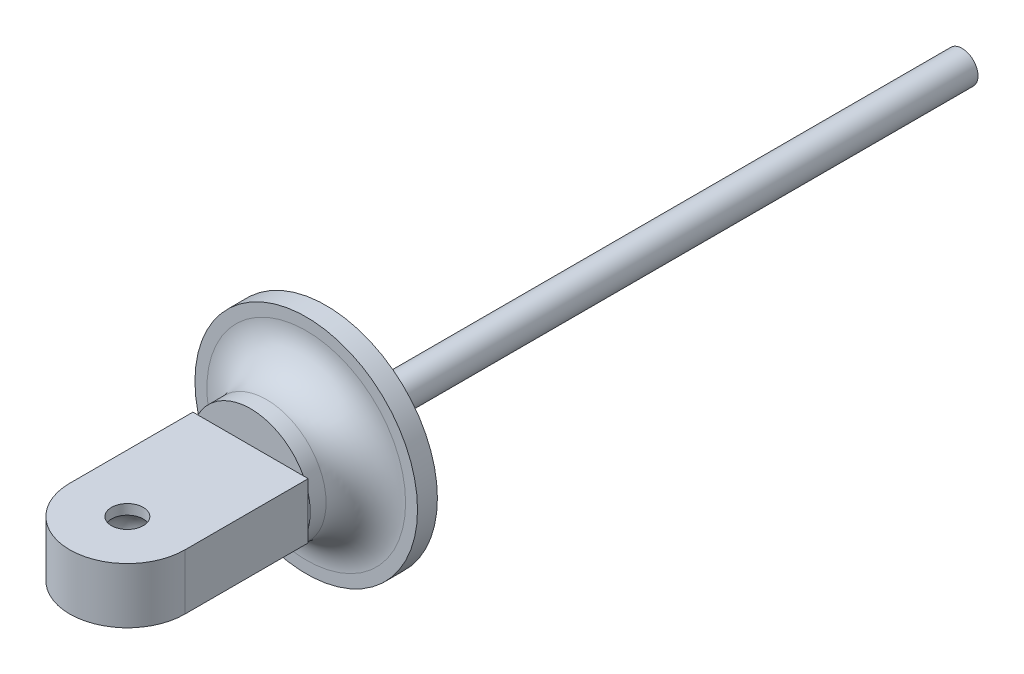
ISO-10303-21;
HEADER;
FILE_DESCRIPTION(('STEP AP214'),'2;1');
FILE_NAME('part.step','',(''),(''),'','','');
FILE_SCHEMA(('AUTOMOTIVE_DESIGN { 1 0 10303 214 1 1 1 1 }'));
ENDSEC;
DATA;
#1=APPLICATION_CONTEXT('core data for automotive mechanical design processes');
#2=APPLICATION_PROTOCOL_DEFINITION('international standard','automotive_design',2000,#1);
#3=PRODUCT_CONTEXT('',#1,'mechanical');
#4=PRODUCT('Part','Part','',(#3));
#5=PRODUCT_RELATED_PRODUCT_CATEGORY('part','',(#4));
#6=PRODUCT_DEFINITION_FORMATION('','',#4);
#7=PRODUCT_DEFINITION_CONTEXT('part definition',#1,'design');
#8=PRODUCT_DEFINITION('design','',#6,#7);
#9=PRODUCT_DEFINITION_SHAPE('','',#8);
#10=(LENGTH_UNIT() NAMED_UNIT(*) SI_UNIT(.MILLI.,.METRE.));
#11=(NAMED_UNIT(*) PLANE_ANGLE_UNIT() SI_UNIT($,.RADIAN.));
#12=(NAMED_UNIT(*) SI_UNIT($,.STERADIAN.) SOLID_ANGLE_UNIT());
#13=UNCERTAINTY_MEASURE_WITH_UNIT(LENGTH_MEASURE(1.E-05),#10,'distance_accuracy_value','');
#14=(GEOMETRIC_REPRESENTATION_CONTEXT(3) GLOBAL_UNCERTAINTY_ASSIGNED_CONTEXT((#13)) GLOBAL_UNIT_ASSIGNED_CONTEXT((#10,
#11,#12)) REPRESENTATION_CONTEXT('',''));
#15=CARTESIAN_POINT('',(0.,0.,0.));
#16=DIRECTION('',(0.,0.,1.));
#17=DIRECTION('',(1.,0.,0.));
#18=AXIS2_PLACEMENT_3D('',#15,#16,#17);
#19=CARTESIAN_POINT('',(0.,3.5,105.));
#20=DIRECTION('',(0.,-1.,0.));
#21=DIRECTION('',(0.,0.,-1.));
#22=AXIS2_PLACEMENT_3D('',#19,#20,#21);
#23=CYLINDRICAL_SURFACE('',#22,2.);
#24=CARTESIAN_POINT('',(0.,-2.23606797749979,105.));
#25=DIRECTION('',(0.,1.,0.));
#26=DIRECTION('',(0.,0.,1.));
#27=AXIS2_PLACEMENT_3D('',#24,#25,#26);
#28=CIRCLE('',#27,2.);
#29=CARTESIAN_POINT('',(0.,-2.23606797749979,107.));
#30=VERTEX_POINT('',#29);
#31=EDGE_CURVE('E40',#30,#30,#28,.T.);
#32=ORIENTED_EDGE('',*,*,#31,.T.);
#33=EDGE_LOOP('',(#32));
#34=FACE_BOUND('',#33,.T.);
#35=CARTESIAN_POINT('',(0.,-3.5,105.));
#36=DIRECTION('',(0.,-1.,0.));
#37=DIRECTION('',(0.,0.,-1.));
#38=AXIS2_PLACEMENT_3D('',#35,#36,#37);
#39=CIRCLE('',#38,2.);
#40=CARTESIAN_POINT('',(0.,-3.5,103.));
#41=VERTEX_POINT('',#40);
#42=EDGE_CURVE('E134',#41,#41,#39,.T.);
#43=ORIENTED_EDGE('',*,*,#42,.T.);
#44=EDGE_LOOP('',(#43));
#45=FACE_BOUND('',#44,.T.);
#46=ADVANCED_FACE('F36',(#34,#45),#23,.F.);
#47=CARTESIAN_POINT('',(0.,0.,89.5));
#48=DIRECTION('',(0.,0.,1.));
#49=DIRECTION('',(1.,0.,0.));
#50=AXIS2_PLACEMENT_3D('',#47,#48,#49);
#51=PLANE('',#50);
#52=DIRECTION('',(1.,0.,0.));
#53=VECTOR('',#52,1.);
#54=CARTESIAN_POINT('',(0.,-3.5,89.5));
#55=LINE('',#54,#53);
#56=CARTESIAN_POINT('',(-6.6332495807108,-3.5,89.5));
#57=VERTEX_POINT('',#56);
#58=CARTESIAN_POINT('',(6.6332495807108,-3.5,89.5));
#59=VERTEX_POINT('',#58);
#60=EDGE_CURVE('E11',#57,#59,#55,.T.);
#61=ORIENTED_EDGE('',*,*,#60,.F.);
#62=CARTESIAN_POINT('',(0.,0.,89.5));
#63=DIRECTION('',(0.,0.,1.));
#64=DIRECTION('',(1.,0.,0.));
#65=AXIS2_PLACEMENT_3D('',#62,#63,#64);
#66=CIRCLE('',#65,7.5);
#67=EDGE_CURVE('E284',#57,#59,#66,.T.);
#68=ORIENTED_EDGE('',*,*,#67,.T.);
#69=EDGE_LOOP('',(#61,#68));
#70=FACE_BOUND('',#69,.T.);
#71=ADVANCED_FACE('F202',(#70),#51,.T.);
#72=CARTESIAN_POINT('',(6.6332495807108,3.5,89.5));
#73=VERTEX_POINT('',#72);
#74=CARTESIAN_POINT('',(-6.6332495807108,3.5,89.5));
#75=VERTEX_POINT('',#74);
#76=EDGE_CURVE('E156',#73,#75,#66,.T.);
#77=ORIENTED_EDGE('',*,*,#76,.T.);
#78=DIRECTION('',(1.,0.,0.));
#79=VECTOR('',#78,1.);
#80=CARTESIAN_POINT('',(0.,3.5,89.5));
#81=LINE('',#80,#79);
#82=EDGE_CURVE('E141',#75,#73,#81,.T.);
#83=ORIENTED_EDGE('',*,*,#82,.T.);
#84=EDGE_LOOP('',(#77,#83));
#85=FACE_BOUND('',#84,.T.);
#86=ADVANCED_FACE('F206',(#85),#51,.T.);
#87=CARTESIAN_POINT('',(7.25,-1.92028643696714,89.5));
#88=VERTEX_POINT('',#87);
#89=CARTESIAN_POINT('',(7.25,1.92028643696714,89.5));
#90=VERTEX_POINT('',#89);
#91=EDGE_CURVE('E116',#88,#90,#66,.T.);
#92=ORIENTED_EDGE('',*,*,#91,.T.);
#93=DIRECTION('',(0.,-1.,0.));
#94=VECTOR('',#93,1.);
#95=CARTESIAN_POINT('',(7.25,3.5,89.5));
#96=LINE('',#95,#94);
#97=EDGE_CURVE('E60',#90,#88,#96,.T.);
#98=ORIENTED_EDGE('',*,*,#97,.T.);
#99=EDGE_LOOP('',(#92,#98));
#100=FACE_BOUND('',#99,.T.);
#101=ADVANCED_FACE('F213',(#100),#51,.T.);
#102=CARTESIAN_POINT('',(0.,0.,80.));
#103=DIRECTION('',(0.,0.,-1.));
#104=DIRECTION('',(-1.,0.,0.));
#105=AXIS2_PLACEMENT_3D('',#102,#103,#104);
#106=CYLINDRICAL_SURFACE('',#105,2.);
#107=CARTESIAN_POINT('',(0.,0.,80.));
#108=DIRECTION('',(0.,0.,1.));
#109=DIRECTION('',(1.,0.,0.));
#110=AXIS2_PLACEMENT_3D('',#107,#108,#109);
#111=CIRCLE('',#110,2.);
#112=CARTESIAN_POINT('',(2.,0.,80.));
#113=VERTEX_POINT('',#112);
#114=EDGE_CURVE('E163',#113,#113,#111,.T.);
#115=ORIENTED_EDGE('',*,*,#114,.F.);
#116=EDGE_LOOP('',(#115));
#117=FACE_BOUND('',#116,.T.);
#118=CARTESIAN_POINT('',(0.,0.,0.));
#119=DIRECTION('',(0.,0.,1.));
#120=DIRECTION('',(1.,0.,0.));
#121=AXIS2_PLACEMENT_3D('',#118,#119,#120);
#122=CIRCLE('',#121,2.);
#123=CARTESIAN_POINT('',(2.,0.,0.));
#124=VERTEX_POINT('',#123);
#125=EDGE_CURVE('E160',#124,#124,#122,.T.);
#126=ORIENTED_EDGE('',*,*,#125,.T.);
#127=EDGE_LOOP('',(#126));
#128=FACE_BOUND('',#127,.T.);
#129=ADVANCED_FACE('F231',(#117,#128),#106,.T.);
#130=CARTESIAN_POINT('',(0.,0.,0.));
#131=DIRECTION('',(0.,0.,1.));
#132=DIRECTION('',(1.,0.,0.));
#133=AXIS2_PLACEMENT_3D('',#130,#131,#132);
#134=PLANE('',#133);
#135=ORIENTED_EDGE('',*,*,#125,.F.);
#136=EDGE_LOOP('',(#135));
#137=FACE_BOUND('',#136,.T.);
#138=ADVANCED_FACE('F236',(#137),#134,.F.);
#139=CARTESIAN_POINT('',(0.,0.,82.5));
#140=DIRECTION('',(0.,0.,-1.));
#141=DIRECTION('',(-1.,0.,0.));
#142=AXIS2_PLACEMENT_3D('',#139,#140,#141);
#143=CYLINDRICAL_SURFACE('',#142,14.);
#144=CARTESIAN_POINT('',(0.,0.,82.5));
#145=DIRECTION('',(0.,0.,1.));
#146=DIRECTION('',(1.,0.,0.));
#147=AXIS2_PLACEMENT_3D('',#144,#145,#146);
#148=CIRCLE('',#147,14.);
#149=CARTESIAN_POINT('',(14.,0.,82.5));
#150=VERTEX_POINT('',#149);
#151=EDGE_CURVE('E157',#150,#150,#148,.T.);
#152=ORIENTED_EDGE('',*,*,#151,.F.);
#153=EDGE_LOOP('',(#152));
#154=FACE_BOUND('',#153,.T.);
#155=CARTESIAN_POINT('',(0.,0.,80.));
#156=DIRECTION('',(0.,0.,1.));
#157=DIRECTION('',(1.,0.,0.));
#158=AXIS2_PLACEMENT_3D('',#155,#156,#157);
#159=CIRCLE('',#158,14.);
#160=CARTESIAN_POINT('',(14.,0.,80.));
#161=VERTEX_POINT('',#160);
#162=EDGE_CURVE('E155',#161,#161,#159,.T.);
#163=ORIENTED_EDGE('',*,*,#162,.T.);
#164=EDGE_LOOP('',(#163));
#165=FACE_BOUND('',#164,.T.);
#166=ADVANCED_FACE('F338',(#154,#165),#143,.T.);
#167=CARTESIAN_POINT('',(0.,0.,82.5));
#168=DIRECTION('',(0.,0.,1.));
#169=DIRECTION('',(1.,0.,0.));
#170=AXIS2_PLACEMENT_3D('',#167,#168,#169);
#171=PLANE('',#170);
#172=CARTESIAN_POINT('',(0.,0.,82.5));
#173=DIRECTION('',(0.,0.,1.));
#174=DIRECTION('',(1.,0.,0.));
#175=AXIS2_PLACEMENT_3D('',#172,#173,#174);
#176=CIRCLE('',#175,12.5);
#177=CARTESIAN_POINT('',(12.5,0.,82.5));
#178=VERTEX_POINT('',#177);
#179=EDGE_CURVE('E171',#178,#178,#176,.F.);
#180=ORIENTED_EDGE('',*,*,#179,.T.);
#181=EDGE_LOOP('',(#180));
#182=FACE_BOUND('',#181,.T.);
#183=ORIENTED_EDGE('',*,*,#151,.T.);
#184=EDGE_LOOP('',(#183));
#185=FACE_BOUND('',#184,.T.);
#186=ADVANCED_FACE('F302',(#182,#185),#171,.T.);
#187=CARTESIAN_POINT('',(0.,0.,80.));
#188=DIRECTION('',(0.,0.,1.));
#189=DIRECTION('',(1.,0.,0.));
#190=AXIS2_PLACEMENT_3D('',#187,#188,#189);
#191=PLANE('',#190);
#192=ORIENTED_EDGE('',*,*,#114,.T.);
#193=EDGE_LOOP('',(#192));
#194=FACE_BOUND('',#193,.T.);
#195=ORIENTED_EDGE('',*,*,#162,.F.);
#196=EDGE_LOOP('',(#195));
#197=FACE_BOUND('',#196,.T.);
#198=ADVANCED_FACE('F227',(#194,#197),#191,.F.);
#199=CARTESIAN_POINT('',(0.,0.,89.5));
#200=DIRECTION('',(0.,0.,-1.));
#201=DIRECTION('',(-1.,0.,0.));
#202=AXIS2_PLACEMENT_3D('',#199,#200,#201);
#203=CYLINDRICAL_SURFACE('',#202,7.5);
#204=CARTESIAN_POINT('',(0.,0.,87.5));
#205=DIRECTION('',(0.,0.,1.));
#206=DIRECTION('',(1.,0.,0.));
#207=AXIS2_PLACEMENT_3D('',#204,#205,#206);
#208=CIRCLE('',#207,7.5);
#209=CARTESIAN_POINT('',(7.5,0.,87.5));
#210=VERTEX_POINT('',#209);
#211=EDGE_CURVE('E166',#210,#210,#208,.T.);
#212=ORIENTED_EDGE('',*,*,#211,.T.);
#213=EDGE_LOOP('',(#212));
#214=FACE_BOUND('',#213,.T.);
#215=EDGE_CURVE('E153',#90,#73,#66,.T.);
#216=ORIENTED_EDGE('',*,*,#215,.F.);
#217=ORIENTED_EDGE('',*,*,#91,.F.);
#218=EDGE_CURVE('E243',#59,#88,#66,.T.);
#219=ORIENTED_EDGE('',*,*,#218,.F.);
#220=ORIENTED_EDGE('',*,*,#67,.F.);
#221=CARTESIAN_POINT('',(-7.25,-1.92028643696714,89.5));
#222=VERTEX_POINT('',#221);
#223=EDGE_CURVE('E278',#222,#57,#66,.T.);
#224=ORIENTED_EDGE('',*,*,#223,.F.);
#225=CARTESIAN_POINT('',(-7.25,1.92028643696714,89.5));
#226=VERTEX_POINT('',#225);
#227=EDGE_CURVE('E282',#226,#222,#66,.T.);
#228=ORIENTED_EDGE('',*,*,#227,.F.);
#229=EDGE_CURVE('E285',#75,#226,#66,.T.);
#230=ORIENTED_EDGE('',*,*,#229,.F.);
#231=ORIENTED_EDGE('',*,*,#76,.F.);
#232=EDGE_LOOP('',(#216,#217,#219,#220,#224,#228,#230,#231));
#233=FACE_BOUND('',#232,.T.);
#234=ADVANCED_FACE('F219',(#214,#233),#203,.T.);
#235=DIRECTION('',(0.,-1.,0.));
#236=VECTOR('',#235,1.);
#237=CARTESIAN_POINT('',(-7.25,3.5,89.5));
#238=LINE('',#237,#236);
#239=EDGE_CURVE('E45',#226,#222,#238,.T.);
#240=ORIENTED_EDGE('',*,*,#239,.F.);
#241=ORIENTED_EDGE('',*,*,#227,.T.);
#242=EDGE_LOOP('',(#240,#241));
#243=FACE_BOUND('',#242,.T.);
#244=ADVANCED_FACE('F209',(#243),#51,.T.);
#245=CARTESIAN_POINT('',(0.,0.,87.5));
#246=DIRECTION('',(0.,0.,1.));
#247=DIRECTION('',(1.,0.,0.));
#248=AXIS2_PLACEMENT_3D('',#245,#246,#247);
#249=TOROIDAL_SURFACE('',#248,12.5,5.);
#250=ORIENTED_EDGE('',*,*,#179,.F.);
#251=EDGE_LOOP('',(#250));
#252=FACE_BOUND('',#251,.T.);
#253=ORIENTED_EDGE('',*,*,#211,.F.);
#254=EDGE_LOOP('',(#253));
#255=FACE_BOUND('',#254,.T.);
#256=ADVANCED_FACE('F38',(#252,#255),#249,.F.);
#257=CARTESIAN_POINT('',(0.,3.5,89.5));
#258=DIRECTION('',(0.,0.,-1.));
#259=DIRECTION('',(-1.,0.,0.));
#260=AXIS2_PLACEMENT_3D('',#257,#258,#259);
#261=PLANE('',#260);
#262=CARTESIAN_POINT('',(7.25,3.5,89.5));
#263=VERTEX_POINT('',#262);
#264=EDGE_CURVE('E150',#263,#90,#96,.T.);
#265=ORIENTED_EDGE('',*,*,#264,.T.);
#266=ORIENTED_EDGE('',*,*,#215,.T.);
#267=EDGE_CURVE('E138',#73,#263,#81,.T.);
#268=ORIENTED_EDGE('',*,*,#267,.T.);
#269=EDGE_LOOP('',(#265,#266,#268));
#270=FACE_BOUND('',#269,.T.);
#271=ADVANCED_FACE('F225',(#270),#261,.T.);
#272=CARTESIAN_POINT('',(-7.25,3.5,89.5));
#273=VERTEX_POINT('',#272);
#274=EDGE_CURVE('E130',#273,#75,#81,.T.);
#275=ORIENTED_EDGE('',*,*,#274,.T.);
#276=ORIENTED_EDGE('',*,*,#229,.T.);
#277=EDGE_CURVE('E148',#273,#226,#238,.T.);
#278=ORIENTED_EDGE('',*,*,#277,.F.);
#279=EDGE_LOOP('',(#275,#276,#278));
#280=FACE_BOUND('',#279,.T.);
#281=ADVANCED_FACE('F270',(#280),#261,.T.);
#282=CARTESIAN_POINT('',(-7.25,-3.5,89.5));
#283=VERTEX_POINT('',#282);
#284=EDGE_CURVE('E140',#222,#283,#238,.T.);
#285=ORIENTED_EDGE('',*,*,#284,.F.);
#286=ORIENTED_EDGE('',*,*,#223,.T.);
#287=EDGE_CURVE('E47',#283,#57,#55,.T.);
#288=ORIENTED_EDGE('',*,*,#287,.F.);
#289=EDGE_LOOP('',(#285,#286,#288));
#290=FACE_BOUND('',#289,.T.);
#291=ADVANCED_FACE('F264',(#290),#261,.T.);
#292=CARTESIAN_POINT('',(-7.25000000000002,3.5,0.));
#293=DIRECTION('',(-1.,0.,0.));
#294=DIRECTION('',(0.,0.,1.));
#295=AXIS2_PLACEMENT_3D('',#292,#293,#294);
#296=PLANE('',#295);
#297=DIRECTION('',(0.,0.,-1.));
#298=VECTOR('',#297,1.);
#299=CARTESIAN_POINT('',(-7.25000000000002,-3.5,0.));
#300=LINE('',#299,#298);
#301=CARTESIAN_POINT('',(-7.25,-3.5,105.));
#302=VERTEX_POINT('',#301);
#303=EDGE_CURVE('E113',#302,#283,#300,.T.);
#304=ORIENTED_EDGE('',*,*,#303,.F.);
#305=DIRECTION('',(0.,-1.,0.));
#306=VECTOR('',#305,1.);
#307=CARTESIAN_POINT('',(-7.25,3.5,105.));
#308=LINE('',#307,#306);
#309=CARTESIAN_POINT('',(-7.25,3.5,105.));
#310=VERTEX_POINT('',#309);
#311=EDGE_CURVE('E105',#310,#302,#308,.T.);
#312=ORIENTED_EDGE('',*,*,#311,.F.);
#313=DIRECTION('',(0.,0.,-1.));
#314=VECTOR('',#313,1.);
#315=CARTESIAN_POINT('',(-7.25000000000002,3.5,0.));
#316=LINE('',#315,#314);
#317=EDGE_CURVE('E110',#310,#273,#316,.T.);
#318=ORIENTED_EDGE('',*,*,#317,.T.);
#319=ORIENTED_EDGE('',*,*,#277,.T.);
#320=ORIENTED_EDGE('',*,*,#239,.T.);
#321=ORIENTED_EDGE('',*,*,#284,.T.);
#322=EDGE_LOOP('',(#304,#312,#318,#319,#320,#321));
#323=FACE_BOUND('',#322,.T.);
#324=ADVANCED_FACE('F107',(#323),#296,.T.);
#325=CARTESIAN_POINT('',(0.,3.5,105.));
#326=DIRECTION('',(0.,-1.,0.));
#327=DIRECTION('',(0.,0.,-1.));
#328=AXIS2_PLACEMENT_3D('',#325,#326,#327);
#329=CYLINDRICAL_SURFACE('',#328,7.25000000000001);
#330=CARTESIAN_POINT('',(0.,-3.5,105.));
#331=DIRECTION('',(0.,1.,0.));
#332=DIRECTION('',(0.,0.,1.));
#333=AXIS2_PLACEMENT_3D('',#330,#331,#332);
#334=CIRCLE('',#333,7.25000000000001);
#335=CARTESIAN_POINT('',(7.25,-3.5,105.));
#336=VERTEX_POINT('',#335);
#337=EDGE_CURVE('E143',#302,#336,#334,.T.);
#338=ORIENTED_EDGE('',*,*,#337,.T.);
#339=DIRECTION('',(0.,-1.,0.));
#340=VECTOR('',#339,1.);
#341=CARTESIAN_POINT('',(7.25,3.5,105.));
#342=LINE('',#341,#340);
#343=CARTESIAN_POINT('',(7.25,3.5,105.));
#344=VERTEX_POINT('',#343);
#345=EDGE_CURVE('E117',#344,#336,#342,.T.);
#346=ORIENTED_EDGE('',*,*,#345,.F.);
#347=CARTESIAN_POINT('',(0.,3.5,105.));
#348=DIRECTION('',(0.,1.,0.));
#349=DIRECTION('',(0.,0.,1.));
#350=AXIS2_PLACEMENT_3D('',#347,#348,#349);
#351=CIRCLE('',#350,7.25000000000001);
#352=EDGE_CURVE('E120',#310,#344,#351,.T.);
#353=ORIENTED_EDGE('',*,*,#352,.F.);
#354=ORIENTED_EDGE('',*,*,#311,.T.);
#355=EDGE_LOOP('',(#338,#346,#353,#354));
#356=FACE_BOUND('',#355,.T.);
#357=ADVANCED_FACE('F121',(#356),#329,.T.);
#358=CARTESIAN_POINT('',(7.25,3.5,0.));
#359=DIRECTION('',(-1.,0.,0.));
#360=DIRECTION('',(0.,0.,1.));
#361=AXIS2_PLACEMENT_3D('',#358,#359,#360);
#362=PLANE('',#361);
#363=DIRECTION('',(0.,0.,-1.));
#364=VECTOR('',#363,1.);
#365=CARTESIAN_POINT('',(7.25,-3.5,0.));
#366=LINE('',#365,#364);
#367=CARTESIAN_POINT('',(7.25,-3.5,89.5));
#368=VERTEX_POINT('',#367);
#369=EDGE_CURVE('E146',#336,#368,#366,.T.);
#370=ORIENTED_EDGE('',*,*,#369,.T.);
#371=EDGE_CURVE('E55',#88,#368,#96,.T.);
#372=ORIENTED_EDGE('',*,*,#371,.F.);
#373=ORIENTED_EDGE('',*,*,#97,.F.);
#374=ORIENTED_EDGE('',*,*,#264,.F.);
#375=DIRECTION('',(0.,0.,-1.));
#376=VECTOR('',#375,1.);
#377=CARTESIAN_POINT('',(7.25,3.5,0.));
#378=LINE('',#377,#376);
#379=EDGE_CURVE('E126',#344,#263,#378,.T.);
#380=ORIENTED_EDGE('',*,*,#379,.F.);
#381=ORIENTED_EDGE('',*,*,#345,.T.);
#382=EDGE_LOOP('',(#370,#372,#373,#374,#380,#381));
#383=FACE_BOUND('',#382,.T.);
#384=ADVANCED_FACE('F256',(#383),#362,.F.);
#385=EDGE_CURVE('E48',#59,#368,#55,.T.);
#386=ORIENTED_EDGE('',*,*,#385,.F.);
#387=ORIENTED_EDGE('',*,*,#218,.T.);
#388=ORIENTED_EDGE('',*,*,#371,.T.);
#389=EDGE_LOOP('',(#386,#387,#388));
#390=FACE_BOUND('',#389,.T.);
#391=ADVANCED_FACE('F253',(#390),#261,.T.);
#392=CARTESIAN_POINT('',(0.,3.5,0.));
#393=DIRECTION('',(0.,1.,0.));
#394=DIRECTION('',(0.,0.,1.));
#395=AXIS2_PLACEMENT_3D('',#392,#393,#394);
#396=PLANE('',#395);
#397=CARTESIAN_POINT('',(0.,3.5,105.));
#398=DIRECTION('',(0.,-1.,0.));
#399=DIRECTION('',(0.,0.,-1.));
#400=AXIS2_PLACEMENT_3D('',#397,#398,#399);
#401=CIRCLE('',#400,2.);
#402=CARTESIAN_POINT('',(0.,3.5,103.));
#403=VERTEX_POINT('',#402);
#404=EDGE_CURVE('E144',#403,#403,#401,.T.);
#405=ORIENTED_EDGE('',*,*,#404,.T.);
#406=EDGE_LOOP('',(#405));
#407=FACE_BOUND('',#406,.T.);
#408=ORIENTED_EDGE('',*,*,#317,.F.);
#409=ORIENTED_EDGE('',*,*,#352,.T.);
#410=ORIENTED_EDGE('',*,*,#379,.T.);
#411=ORIENTED_EDGE('',*,*,#267,.F.);
#412=ORIENTED_EDGE('',*,*,#82,.F.);
#413=ORIENTED_EDGE('',*,*,#274,.F.);
#414=EDGE_LOOP('',(#408,#409,#410,#411,#412,#413));
#415=FACE_BOUND('',#414,.T.);
#416=ADVANCED_FACE('F128',(#407,#415),#396,.T.);
#417=CARTESIAN_POINT('',(0.,-3.5,0.));
#418=DIRECTION('',(0.,1.,0.));
#419=DIRECTION('',(0.,0.,1.));
#420=AXIS2_PLACEMENT_3D('',#417,#418,#419);
#421=PLANE('',#420);
#422=ORIENTED_EDGE('',*,*,#42,.F.);
#423=EDGE_LOOP('',(#422));
#424=FACE_BOUND('',#423,.T.);
#425=ORIENTED_EDGE('',*,*,#303,.T.);
#426=ORIENTED_EDGE('',*,*,#287,.T.);
#427=ORIENTED_EDGE('',*,*,#60,.T.);
#428=ORIENTED_EDGE('',*,*,#385,.T.);
#429=ORIENTED_EDGE('',*,*,#369,.F.);
#430=ORIENTED_EDGE('',*,*,#337,.F.);
#431=EDGE_LOOP('',(#425,#426,#427,#428,#429,#430));
#432=FACE_BOUND('',#431,.T.);
#433=ADVANCED_FACE('F190',(#424,#432),#421,.F.);
#434=CARTESIAN_POINT('',(0.,2.23606797749979,105.));
#435=DIRECTION('',(0.,-1.,0.));
#436=DIRECTION('',(0.,0.,-1.));
#437=AXIS2_PLACEMENT_3D('',#434,#435,#436);
#438=CIRCLE('',#437,2.);
#439=CARTESIAN_POINT('',(0.,2.23606797749979,103.));
#440=VERTEX_POINT('',#439);
#441=EDGE_CURVE('E173',#440,#440,#438,.T.);
#442=ORIENTED_EDGE('',*,*,#441,.T.);
#443=EDGE_LOOP('',(#442));
#444=FACE_BOUND('',#443,.T.);
#445=ORIENTED_EDGE('',*,*,#404,.F.);
#446=EDGE_LOOP('',(#445));
#447=FACE_BOUND('',#446,.T.);
#448=ADVANCED_FACE('F187',(#444,#447),#23,.F.);
#449=CARTESIAN_POINT('',(0.,0.,105.));
#450=DIRECTION('',(0.,0.,1.));
#451=DIRECTION('',(-1.,0.,0.));
#452=AXIS2_PLACEMENT_3D('',#449,#450,#451);
#453=SPHERICAL_SURFACE('',#452,3.);
#454=CARTESIAN_POINT('',(0.,0.,105.));
#455=DIRECTION('',(0.,-1.,0.));
#456=DIRECTION('',(0.,0.,-1.));
#457=AXIS2_PLACEMENT_3D('',#454,#455,#456);
#458=SPHERICAL_SURFACE('',#457,3.);
#459=ORIENTED_EDGE('',*,*,#441,.F.);
#460=EDGE_LOOP('',(#459));
#461=FACE_BOUND('',#460,.T.);
#462=ORIENTED_EDGE('',*,*,#31,.F.);
#463=EDGE_LOOP('',(#462));
#464=FACE_BOUND('',#463,.T.);
#465=ADVANCED_FACE('F189',(#461,#464),#458,.F.);
#466=CLOSED_SHELL('',(#46,#71,#86,#101,#129,#138,#166,#186,#198,#234,#244,#256,#271,#281,#291,
#324,#357,#384,#391,#416,#433,#448,#465));
#467=MANIFOLD_SOLID_BREP('B2',#466);
#468=ADVANCED_BREP_SHAPE_REPRESENTATION('',(#18,#467),#14);
#469=SHAPE_DEFINITION_REPRESENTATION(#9,#468);
ENDSEC;
END-ISO-10303-21;
